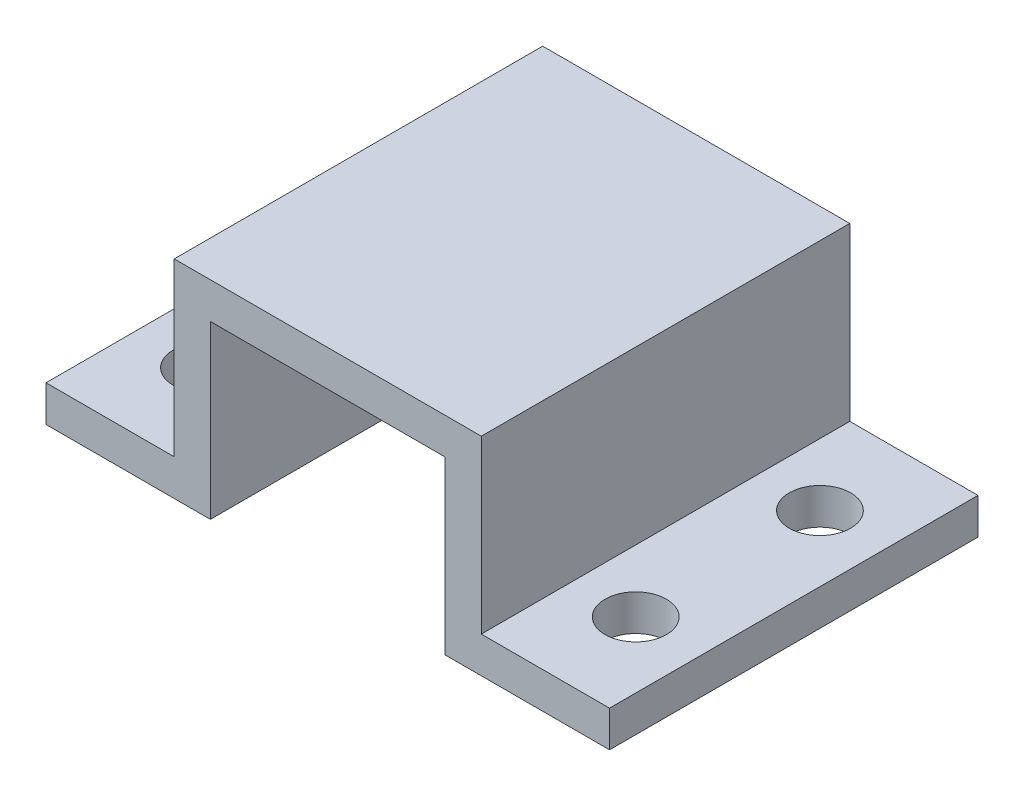
ISO-10303-21;
HEADER;
FILE_DESCRIPTION(('STEP AP214'),'2;1');
FILE_NAME('part.step','',(''),(''),'','','');
FILE_SCHEMA(('AUTOMOTIVE_DESIGN { 1 0 10303 214 1 1 1 1 }'));
ENDSEC;
DATA;
#1=APPLICATION_CONTEXT('core data for automotive mechanical design processes');
#2=APPLICATION_PROTOCOL_DEFINITION('international standard','automotive_design',2000,#1);
#3=PRODUCT_CONTEXT('',#1,'mechanical');
#4=PRODUCT('Part','Part','',(#3));
#5=PRODUCT_RELATED_PRODUCT_CATEGORY('part','',(#4));
#6=PRODUCT_DEFINITION_FORMATION('','',#4);
#7=PRODUCT_DEFINITION_CONTEXT('part definition',#1,'design');
#8=PRODUCT_DEFINITION('design','',#6,#7);
#9=PRODUCT_DEFINITION_SHAPE('','',#8);
#10=(LENGTH_UNIT() NAMED_UNIT(*) SI_UNIT(.MILLI.,.METRE.));
#11=(NAMED_UNIT(*) PLANE_ANGLE_UNIT() SI_UNIT($,.RADIAN.));
#12=(NAMED_UNIT(*) SI_UNIT($,.STERADIAN.) SOLID_ANGLE_UNIT());
#13=UNCERTAINTY_MEASURE_WITH_UNIT(LENGTH_MEASURE(1.E-05),#10,'distance_accuracy_value','');
#14=(GEOMETRIC_REPRESENTATION_CONTEXT(3) GLOBAL_UNCERTAINTY_ASSIGNED_CONTEXT((#13)) GLOBAL_UNIT_ASSIGNED_CONTEXT((#10,
#11,#12)) REPRESENTATION_CONTEXT('',''));
#15=CARTESIAN_POINT('',(0.,0.,0.));
#16=DIRECTION('',(0.,0.,1.));
#17=DIRECTION('',(1.,0.,0.));
#18=AXIS2_PLACEMENT_3D('',#15,#16,#17);
#19=CARTESIAN_POINT('',(0.,9.49,0.));
#20=DIRECTION('',(0.,1.,0.));
#21=DIRECTION('',(0.,0.,1.));
#22=AXIS2_PLACEMENT_3D('',#19,#20,#21);
#23=PLANE('',#22);
#24=DIRECTION('',(0.,0.,1.));
#25=VECTOR('',#24,1.);
#26=CARTESIAN_POINT('',(6.5,9.49,-10.2));
#27=LINE('',#26,#25);
#28=CARTESIAN_POINT('',(6.5,9.49,-10.2));
#29=VERTEX_POINT('',#28);
#30=CARTESIAN_POINT('',(6.5,9.49,10.2));
#31=VERTEX_POINT('',#30);
#32=EDGE_CURVE('E149',#29,#31,#27,.T.);
#33=ORIENTED_EDGE('',*,*,#32,.T.);
#34=DIRECTION('',(1.,0.,0.));
#35=VECTOR('',#34,1.);
#36=CARTESIAN_POINT('',(-8.49999999999999,9.49,10.2));
#37=LINE('',#36,#35);
#38=CARTESIAN_POINT('',(-6.5,9.49,10.2));
#39=VERTEX_POINT('',#38);
#40=EDGE_CURVE('E145',#39,#31,#37,.T.);
#41=ORIENTED_EDGE('',*,*,#40,.F.);
#42=DIRECTION('',(0.,0.,-1.));
#43=VECTOR('',#42,1.);
#44=CARTESIAN_POINT('',(-6.5,9.49,-10.2));
#45=LINE('',#44,#43);
#46=CARTESIAN_POINT('',(-6.5,9.49,-10.2));
#47=VERTEX_POINT('',#46);
#48=EDGE_CURVE('E160',#39,#47,#45,.T.);
#49=ORIENTED_EDGE('',*,*,#48,.T.);
#50=DIRECTION('',(-1.,0.,0.));
#51=VECTOR('',#50,1.);
#52=CARTESIAN_POINT('',(-8.49999999999999,9.49,-10.2));
#53=LINE('',#52,#51);
#54=EDGE_CURVE('E136',#29,#47,#53,.T.);
#55=ORIENTED_EDGE('',*,*,#54,.F.);
#56=EDGE_LOOP('',(#33,#41,#49,#55));
#57=FACE_BOUND('',#56,.T.);
#58=ADVANCED_FACE('F43',(#57),#23,.F.);
#59=CARTESIAN_POINT('',(0.,2.,0.));
#60=DIRECTION('',(0.,1.,0.));
#61=DIRECTION('',(0.,0.,1.));
#62=AXIS2_PLACEMENT_3D('',#59,#60,#61);
#63=PLANE('',#62);
#64=CARTESIAN_POINT('',(-11.95,2.,-5.1));
#65=DIRECTION('',(0.,1.,0.));
#66=DIRECTION('',(0.,0.,1.));
#67=AXIS2_PLACEMENT_3D('',#64,#65,#66);
#68=CIRCLE('',#67,1.7);
#69=CARTESIAN_POINT('',(-11.95,2.,-3.4));
#70=VERTEX_POINT('',#69);
#71=EDGE_CURVE('E203',#70,#70,#68,.T.);
#72=ORIENTED_EDGE('',*,*,#71,.F.);
#73=EDGE_LOOP('',(#72));
#74=FACE_BOUND('',#73,.T.);
#75=CARTESIAN_POINT('',(-11.95,2.,5.1));
#76=DIRECTION('',(0.,1.,0.));
#77=DIRECTION('',(0.,0.,1.));
#78=AXIS2_PLACEMENT_3D('',#75,#76,#77);
#79=CIRCLE('',#78,1.7);
#80=CARTESIAN_POINT('',(-11.95,2.,6.8));
#81=VERTEX_POINT('',#80);
#82=EDGE_CURVE('E207',#81,#81,#79,.F.);
#83=ORIENTED_EDGE('',*,*,#82,.T.);
#84=EDGE_LOOP('',(#83));
#85=FACE_BOUND('',#84,.T.);
#86=DIRECTION('',(1.,0.,0.));
#87=VECTOR('',#86,1.);
#88=CARTESIAN_POINT('',(0.,2.,10.2));
#89=LINE('',#88,#87);
#90=CARTESIAN_POINT('',(-15.6,2.,10.2));
#91=VERTEX_POINT('',#90);
#92=CARTESIAN_POINT('',(-8.49999999999999,2.,10.2));
#93=VERTEX_POINT('',#92);
#94=EDGE_CURVE('E59',#91,#93,#89,.T.);
#95=ORIENTED_EDGE('',*,*,#94,.T.);
#96=DIRECTION('',(0.,0.,-1.));
#97=VECTOR('',#96,1.);
#98=CARTESIAN_POINT('',(-8.49999999999999,2.,0.));
#99=LINE('',#98,#97);
#100=CARTESIAN_POINT('',(-8.49999999999999,2.,-10.2));
#101=VERTEX_POINT('',#100);
#102=EDGE_CURVE('E63',#93,#101,#99,.T.);
#103=ORIENTED_EDGE('',*,*,#102,.T.);
#104=DIRECTION('',(1.,0.,0.));
#105=VECTOR('',#104,1.);
#106=CARTESIAN_POINT('',(0.,2.,-10.2));
#107=LINE('',#106,#105);
#108=CARTESIAN_POINT('',(-15.6,2.,-10.2));
#109=VERTEX_POINT('',#108);
#110=EDGE_CURVE('E193',#109,#101,#107,.T.);
#111=ORIENTED_EDGE('',*,*,#110,.F.);
#112=DIRECTION('',(0.,0.,-1.));
#113=VECTOR('',#112,1.);
#114=CARTESIAN_POINT('',(-15.6,2.,0.));
#115=LINE('',#114,#113);
#116=EDGE_CURVE('E196',#91,#109,#115,.T.);
#117=ORIENTED_EDGE('',*,*,#116,.F.);
#118=EDGE_LOOP('',(#95,#103,#111,#117));
#119=FACE_BOUND('',#118,.T.);
#120=ADVANCED_FACE('F353',(#74,#85,#119),#63,.T.);
#121=CARTESIAN_POINT('',(-6.5,2.,0.));
#122=DIRECTION('',(1.,0.,0.));
#123=DIRECTION('',(0.,0.,-1.));
#124=AXIS2_PLACEMENT_3D('',#121,#122,#123);
#125=PLANE('',#124);
#126=DIRECTION('',(0.,0.,1.));
#127=VECTOR('',#126,1.);
#128=CARTESIAN_POINT('',(-6.5,0.,0.));
#129=LINE('',#128,#127);
#130=CARTESIAN_POINT('',(-6.5,0.,-10.2));
#131=VERTEX_POINT('',#130);
#132=CARTESIAN_POINT('',(-6.5,0.,10.2));
#133=VERTEX_POINT('',#132);
#134=EDGE_CURVE('E192',#131,#133,#129,.T.);
#135=ORIENTED_EDGE('',*,*,#134,.F.);
#136=DIRECTION('',(0.,-1.,0.));
#137=VECTOR('',#136,1.);
#138=CARTESIAN_POINT('',(-6.5,2.,-10.2));
#139=LINE('',#138,#137);
#140=EDGE_CURVE('E11',#47,#131,#139,.T.);
#141=ORIENTED_EDGE('',*,*,#140,.F.);
#142=ORIENTED_EDGE('',*,*,#48,.F.);
#143=DIRECTION('',(0.,-1.,0.));
#144=VECTOR('',#143,1.);
#145=CARTESIAN_POINT('',(-6.5,2.,10.2));
#146=LINE('',#145,#144);
#147=EDGE_CURVE('E211',#39,#133,#146,.T.);
#148=ORIENTED_EDGE('',*,*,#147,.T.);
#149=EDGE_LOOP('',(#135,#141,#142,#148));
#150=FACE_BOUND('',#149,.T.);
#151=ADVANCED_FACE('F45',(#150),#125,.T.);
#152=CARTESIAN_POINT('',(0.,2.,-10.2));
#153=DIRECTION('',(0.,0.,-1.));
#154=DIRECTION('',(-1.,0.,0.));
#155=AXIS2_PLACEMENT_3D('',#152,#153,#154);
#156=PLANE('',#155);
#157=ORIENTED_EDGE('',*,*,#140,.T.);
#158=DIRECTION('',(1.,0.,0.));
#159=VECTOR('',#158,1.);
#160=CARTESIAN_POINT('',(0.,0.,-10.2));
#161=LINE('',#160,#159);
#162=CARTESIAN_POINT('',(-15.6,0.,-10.2));
#163=VERTEX_POINT('',#162);
#164=EDGE_CURVE('E215',#163,#131,#161,.T.);
#165=ORIENTED_EDGE('',*,*,#164,.F.);
#166=DIRECTION('',(0.,-1.,0.));
#167=VECTOR('',#166,1.);
#168=CARTESIAN_POINT('',(-15.6,2.,-10.2));
#169=LINE('',#168,#167);
#170=EDGE_CURVE('E52',#109,#163,#169,.T.);
#171=ORIENTED_EDGE('',*,*,#170,.F.);
#172=ORIENTED_EDGE('',*,*,#110,.T.);
#173=DIRECTION('',(0.,-1.,0.));
#174=VECTOR('',#173,1.);
#175=CARTESIAN_POINT('',(-8.49999999999999,9.49,-10.2));
#176=LINE('',#175,#174);
#177=CARTESIAN_POINT('',(-8.49999999999999,11.49,-10.2));
#178=VERTEX_POINT('',#177);
#179=EDGE_CURVE('E187',#178,#101,#176,.T.);
#180=ORIENTED_EDGE('',*,*,#179,.F.);
#181=DIRECTION('',(-1.,0.,0.));
#182=VECTOR('',#181,1.);
#183=CARTESIAN_POINT('',(-8.49999999999999,11.49,-10.2));
#184=LINE('',#183,#182);
#185=CARTESIAN_POINT('',(8.49999999999999,11.49,-10.2));
#186=VERTEX_POINT('',#185);
#187=EDGE_CURVE('E178',#186,#178,#184,.T.);
#188=ORIENTED_EDGE('',*,*,#187,.F.);
#189=DIRECTION('',(0.,-1.,0.));
#190=VECTOR('',#189,1.);
#191=CARTESIAN_POINT('',(8.49999999999999,11.49,-10.2));
#192=LINE('',#191,#190);
#193=CARTESIAN_POINT('',(8.49999999999999,2.,-10.2));
#194=VERTEX_POINT('',#193);
#195=EDGE_CURVE('E174',#186,#194,#192,.T.);
#196=ORIENTED_EDGE('',*,*,#195,.T.);
#197=DIRECTION('',(-1.,0.,0.));
#198=VECTOR('',#197,1.);
#199=CARTESIAN_POINT('',(0.,2.,-10.2));
#200=LINE('',#199,#198);
#201=CARTESIAN_POINT('',(15.6,2.,-10.2));
#202=VERTEX_POINT('',#201);
#203=EDGE_CURVE('E277',#202,#194,#200,.T.);
#204=ORIENTED_EDGE('',*,*,#203,.F.);
#205=DIRECTION('',(0.,-1.,0.));
#206=VECTOR('',#205,1.);
#207=CARTESIAN_POINT('',(15.6,2.,-10.2));
#208=LINE('',#207,#206);
#209=CARTESIAN_POINT('',(15.6,0.,-10.2));
#210=VERTEX_POINT('',#209);
#211=EDGE_CURVE('E278',#202,#210,#208,.T.);
#212=ORIENTED_EDGE('',*,*,#211,.T.);
#213=DIRECTION('',(-1.,0.,0.));
#214=VECTOR('',#213,1.);
#215=CARTESIAN_POINT('',(0.,0.,-10.2));
#216=LINE('',#215,#214);
#217=CARTESIAN_POINT('',(6.50000000000001,0.,-10.2));
#218=VERTEX_POINT('',#217);
#219=EDGE_CURVE('E140',#210,#218,#216,.T.);
#220=ORIENTED_EDGE('',*,*,#219,.T.);
#221=DIRECTION('',(0.,-1.,0.));
#222=VECTOR('',#221,1.);
#223=CARTESIAN_POINT('',(6.50000000000001,2.,-10.2));
#224=LINE('',#223,#222);
#225=EDGE_CURVE('E132',#29,#218,#224,.T.);
#226=ORIENTED_EDGE('',*,*,#225,.F.);
#227=ORIENTED_EDGE('',*,*,#54,.T.);
#228=EDGE_LOOP('',(#157,#165,#171,#172,#180,#188,#196,#204,#212,#220,#226,#227));
#229=FACE_BOUND('',#228,.T.);
#230=ADVANCED_FACE('F134',(#229),#156,.T.);
#231=CARTESIAN_POINT('',(-15.6,2.,0.));
#232=DIRECTION('',(-1.,0.,0.));
#233=DIRECTION('',(0.,0.,1.));
#234=AXIS2_PLACEMENT_3D('',#231,#232,#233);
#235=PLANE('',#234);
#236=DIRECTION('',(0.,0.,-1.));
#237=VECTOR('',#236,1.);
#238=CARTESIAN_POINT('',(-15.6,0.,0.));
#239=LINE('',#238,#237);
#240=CARTESIAN_POINT('',(-15.6,0.,10.2));
#241=VERTEX_POINT('',#240);
#242=EDGE_CURVE('E218',#241,#163,#239,.T.);
#243=ORIENTED_EDGE('',*,*,#242,.F.);
#244=DIRECTION('',(0.,-1.,0.));
#245=VECTOR('',#244,1.);
#246=CARTESIAN_POINT('',(-15.6,2.,10.2));
#247=LINE('',#246,#245);
#248=EDGE_CURVE('E234',#91,#241,#247,.T.);
#249=ORIENTED_EDGE('',*,*,#248,.F.);
#250=ORIENTED_EDGE('',*,*,#116,.T.);
#251=ORIENTED_EDGE('',*,*,#170,.T.);
#252=EDGE_LOOP('',(#243,#249,#250,#251));
#253=FACE_BOUND('',#252,.T.);
#254=ADVANCED_FACE('F241',(#253),#235,.T.);
#255=CARTESIAN_POINT('',(-11.95,2.,-5.1));
#256=DIRECTION('',(0.,-1.,0.));
#257=DIRECTION('',(0.,0.,-1.));
#258=AXIS2_PLACEMENT_3D('',#255,#256,#257);
#259=CYLINDRICAL_SURFACE('',#258,1.7);
#260=ORIENTED_EDGE('',*,*,#71,.T.);
#261=EDGE_LOOP('',(#260));
#262=FACE_BOUND('',#261,.T.);
#263=CARTESIAN_POINT('',(-11.95,0.,-5.1));
#264=DIRECTION('',(0.,1.,0.));
#265=DIRECTION('',(0.,0.,1.));
#266=AXIS2_PLACEMENT_3D('',#263,#264,#265);
#267=CIRCLE('',#266,1.7);
#268=CARTESIAN_POINT('',(-11.95,0.,-3.4));
#269=VERTEX_POINT('',#268);
#270=EDGE_CURVE('E224',#269,#269,#267,.T.);
#271=ORIENTED_EDGE('',*,*,#270,.F.);
#272=EDGE_LOOP('',(#271));
#273=FACE_BOUND('',#272,.T.);
#274=ADVANCED_FACE('F372',(#262,#273),#259,.F.);
#275=CARTESIAN_POINT('',(0.,2.,10.2));
#276=DIRECTION('',(0.,0.,-1.));
#277=DIRECTION('',(-1.,0.,0.));
#278=AXIS2_PLACEMENT_3D('',#275,#276,#277);
#279=PLANE('',#278);
#280=ORIENTED_EDGE('',*,*,#147,.F.);
#281=ORIENTED_EDGE('',*,*,#40,.T.);
#282=DIRECTION('',(0.,-1.,0.));
#283=VECTOR('',#282,1.);
#284=CARTESIAN_POINT('',(6.50000000000001,2.,10.2));
#285=LINE('',#284,#283);
#286=CARTESIAN_POINT('',(6.50000000000001,0.,10.2));
#287=VERTEX_POINT('',#286);
#288=EDGE_CURVE('E146',#31,#287,#285,.T.);
#289=ORIENTED_EDGE('',*,*,#288,.T.);
#290=DIRECTION('',(-1.,0.,0.));
#291=VECTOR('',#290,1.);
#292=CARTESIAN_POINT('',(0.,0.,10.2));
#293=LINE('',#292,#291);
#294=CARTESIAN_POINT('',(15.6,0.,10.2));
#295=VERTEX_POINT('',#294);
#296=EDGE_CURVE('E251',#295,#287,#293,.T.);
#297=ORIENTED_EDGE('',*,*,#296,.F.);
#298=DIRECTION('',(0.,-1.,0.));
#299=VECTOR('',#298,1.);
#300=CARTESIAN_POINT('',(15.6,2.,10.2));
#301=LINE('',#300,#299);
#302=CARTESIAN_POINT('',(15.6,2.,10.2));
#303=VERTEX_POINT('',#302);
#304=EDGE_CURVE('E253',#303,#295,#301,.T.);
#305=ORIENTED_EDGE('',*,*,#304,.F.);
#306=DIRECTION('',(-1.,0.,0.));
#307=VECTOR('',#306,1.);
#308=CARTESIAN_POINT('',(0.,2.,10.2));
#309=LINE('',#308,#307);
#310=CARTESIAN_POINT('',(8.49999999999999,2.,10.2));
#311=VERTEX_POINT('',#310);
#312=EDGE_CURVE('E300',#303,#311,#309,.T.);
#313=ORIENTED_EDGE('',*,*,#312,.T.);
#314=DIRECTION('',(0.,-1.,0.));
#315=VECTOR('',#314,1.);
#316=CARTESIAN_POINT('',(8.49999999999999,11.49,10.2));
#317=LINE('',#316,#315);
#318=CARTESIAN_POINT('',(8.49999999999999,11.49,10.2));
#319=VERTEX_POINT('',#318);
#320=EDGE_CURVE('E177',#319,#311,#317,.T.);
#321=ORIENTED_EDGE('',*,*,#320,.F.);
#322=DIRECTION('',(1.,0.,0.));
#323=VECTOR('',#322,1.);
#324=CARTESIAN_POINT('',(-8.49999999999999,11.49,10.2));
#325=LINE('',#324,#323);
#326=CARTESIAN_POINT('',(-8.49999999999999,11.49,10.2));
#327=VERTEX_POINT('',#326);
#328=EDGE_CURVE('E168',#327,#319,#325,.T.);
#329=ORIENTED_EDGE('',*,*,#328,.F.);
#330=DIRECTION('',(0.,-1.,0.));
#331=VECTOR('',#330,1.);
#332=CARTESIAN_POINT('',(-8.49999999999999,9.49,10.2));
#333=LINE('',#332,#331);
#334=EDGE_CURVE('E183',#327,#93,#333,.T.);
#335=ORIENTED_EDGE('',*,*,#334,.T.);
#336=ORIENTED_EDGE('',*,*,#94,.F.);
#337=ORIENTED_EDGE('',*,*,#248,.T.);
#338=DIRECTION('',(1.,0.,0.));
#339=VECTOR('',#338,1.);
#340=CARTESIAN_POINT('',(0.,0.,10.2));
#341=LINE('',#340,#339);
#342=EDGE_CURVE('E221',#241,#133,#341,.T.);
#343=ORIENTED_EDGE('',*,*,#342,.T.);
#344=EDGE_LOOP('',(#280,#281,#289,#297,#305,#313,#321,#329,#335,#336,#337,#343));
#345=FACE_BOUND('',#344,.T.);
#346=ADVANCED_FACE('F248',(#345),#279,.F.);
#347=CARTESIAN_POINT('',(-11.95,2.,5.1));
#348=DIRECTION('',(0.,-1.,0.));
#349=DIRECTION('',(0.,0.,-1.));
#350=AXIS2_PLACEMENT_3D('',#347,#348,#349);
#351=CYLINDRICAL_SURFACE('',#350,1.7);
#352=ORIENTED_EDGE('',*,*,#82,.F.);
#353=EDGE_LOOP('',(#352));
#354=FACE_BOUND('',#353,.T.);
#355=CARTESIAN_POINT('',(-11.95,0.,5.1));
#356=DIRECTION('',(0.,1.,0.));
#357=DIRECTION('',(0.,0.,1.));
#358=AXIS2_PLACEMENT_3D('',#355,#356,#357);
#359=CIRCLE('',#358,1.7);
#360=CARTESIAN_POINT('',(-11.95,0.,6.8));
#361=VERTEX_POINT('',#360);
#362=EDGE_CURVE('E197',#361,#361,#359,.F.);
#363=ORIENTED_EDGE('',*,*,#362,.T.);
#364=EDGE_LOOP('',(#363));
#365=FACE_BOUND('',#364,.T.);
#366=ADVANCED_FACE('F368',(#354,#365),#351,.F.);
#367=CARTESIAN_POINT('',(0.,0.,0.));
#368=DIRECTION('',(0.,1.,0.));
#369=DIRECTION('',(0.,0.,1.));
#370=AXIS2_PLACEMENT_3D('',#367,#368,#369);
#371=PLANE('',#370);
#372=ORIENTED_EDGE('',*,*,#134,.T.);
#373=ORIENTED_EDGE('',*,*,#342,.F.);
#374=ORIENTED_EDGE('',*,*,#242,.T.);
#375=ORIENTED_EDGE('',*,*,#164,.T.);
#376=EDGE_LOOP('',(#372,#373,#374,#375));
#377=FACE_BOUND('',#376,.T.);
#378=ORIENTED_EDGE('',*,*,#362,.F.);
#379=EDGE_LOOP('',(#378));
#380=FACE_BOUND('',#379,.T.);
#381=ORIENTED_EDGE('',*,*,#270,.T.);
#382=EDGE_LOOP('',(#381));
#383=FACE_BOUND('',#382,.T.);
#384=ADVANCED_FACE('F245',(#377,#380,#383),#371,.F.);
#385=CARTESIAN_POINT('',(-8.49999999999999,9.49,-10.2));
#386=DIRECTION('',(1.,0.,0.));
#387=DIRECTION('',(0.,0.,-1.));
#388=AXIS2_PLACEMENT_3D('',#385,#386,#387);
#389=PLANE('',#388);
#390=ORIENTED_EDGE('',*,*,#102,.F.);
#391=ORIENTED_EDGE('',*,*,#334,.F.);
#392=DIRECTION('',(0.,0.,1.));
#393=VECTOR('',#392,1.);
#394=CARTESIAN_POINT('',(-8.49999999999999,11.49,-10.2));
#395=LINE('',#394,#393);
#396=EDGE_CURVE('E162',#178,#327,#395,.T.);
#397=ORIENTED_EDGE('',*,*,#396,.F.);
#398=ORIENTED_EDGE('',*,*,#179,.T.);
#399=EDGE_LOOP('',(#390,#391,#397,#398));
#400=FACE_BOUND('',#399,.T.);
#401=ADVANCED_FACE('F295',(#400),#389,.F.);
#402=CARTESIAN_POINT('',(8.49999999999999,11.49,-10.2));
#403=DIRECTION('',(-1.,0.,0.));
#404=DIRECTION('',(0.,0.,1.));
#405=AXIS2_PLACEMENT_3D('',#402,#403,#404);
#406=PLANE('',#405);
#407=ORIENTED_EDGE('',*,*,#320,.T.);
#408=DIRECTION('',(0.,0.,1.));
#409=VECTOR('',#408,1.);
#410=CARTESIAN_POINT('',(8.49999999999999,2.,0.));
#411=LINE('',#410,#409);
#412=EDGE_CURVE('E156',#194,#311,#411,.T.);
#413=ORIENTED_EDGE('',*,*,#412,.F.);
#414=ORIENTED_EDGE('',*,*,#195,.F.);
#415=DIRECTION('',(0.,0.,-1.));
#416=VECTOR('',#415,1.);
#417=CARTESIAN_POINT('',(8.49999999999999,11.49,-10.2));
#418=LINE('',#417,#416);
#419=EDGE_CURVE('E285',#319,#186,#418,.T.);
#420=ORIENTED_EDGE('',*,*,#419,.F.);
#421=EDGE_LOOP('',(#407,#413,#414,#420));
#422=FACE_BOUND('',#421,.T.);
#423=ADVANCED_FACE('F304',(#422),#406,.F.);
#424=CARTESIAN_POINT('',(0.,11.49,0.));
#425=DIRECTION('',(0.,1.,0.));
#426=DIRECTION('',(0.,0.,1.));
#427=AXIS2_PLACEMENT_3D('',#424,#425,#426);
#428=PLANE('',#427);
#429=ORIENTED_EDGE('',*,*,#396,.T.);
#430=ORIENTED_EDGE('',*,*,#328,.T.);
#431=ORIENTED_EDGE('',*,*,#419,.T.);
#432=ORIENTED_EDGE('',*,*,#187,.T.);
#433=EDGE_LOOP('',(#429,#430,#431,#432));
#434=FACE_BOUND('',#433,.T.);
#435=ADVANCED_FACE('F291',(#434),#428,.T.);
#436=CARTESIAN_POINT('',(0.,2.,0.));
#437=DIRECTION('',(0.,1.,0.));
#438=DIRECTION('',(0.,0.,1.));
#439=AXIS2_PLACEMENT_3D('',#436,#437,#438);
#440=PLANE('',#439);
#441=CARTESIAN_POINT('',(11.95,2.,5.1));
#442=DIRECTION('',(0.,1.,0.));
#443=DIRECTION('',(0.,0.,1.));
#444=AXIS2_PLACEMENT_3D('',#441,#442,#443);
#445=CIRCLE('',#444,1.7);
#446=CARTESIAN_POINT('',(11.95,2.,6.8));
#447=VERTEX_POINT('',#446);
#448=EDGE_CURVE('E320',#447,#447,#445,.T.);
#449=ORIENTED_EDGE('',*,*,#448,.F.);
#450=EDGE_LOOP('',(#449));
#451=FACE_BOUND('',#450,.T.);
#452=CARTESIAN_POINT('',(11.95,2.,-5.1));
#453=DIRECTION('',(0.,1.,0.));
#454=DIRECTION('',(0.,0.,1.));
#455=AXIS2_PLACEMENT_3D('',#452,#453,#454);
#456=CIRCLE('',#455,1.7);
#457=CARTESIAN_POINT('',(11.95,2.,-3.4));
#458=VERTEX_POINT('',#457);
#459=EDGE_CURVE('E280',#458,#458,#456,.F.);
#460=ORIENTED_EDGE('',*,*,#459,.T.);
#461=EDGE_LOOP('',(#460));
#462=FACE_BOUND('',#461,.T.);
#463=ORIENTED_EDGE('',*,*,#203,.T.);
#464=ORIENTED_EDGE('',*,*,#412,.T.);
#465=ORIENTED_EDGE('',*,*,#312,.F.);
#466=DIRECTION('',(0.,0.,-1.));
#467=VECTOR('',#466,1.);
#468=CARTESIAN_POINT('',(15.6,2.,0.));
#469=LINE('',#468,#467);
#470=EDGE_CURVE('E310',#303,#202,#469,.T.);
#471=ORIENTED_EDGE('',*,*,#470,.T.);
#472=EDGE_LOOP('',(#463,#464,#465,#471));
#473=FACE_BOUND('',#472,.T.);
#474=ADVANCED_FACE('F308',(#451,#462,#473),#440,.T.);
#475=CARTESIAN_POINT('',(6.50000000000001,2.,0.));
#476=DIRECTION('',(1.,0.,0.));
#477=DIRECTION('',(0.,0.,-1.));
#478=AXIS2_PLACEMENT_3D('',#475,#476,#477);
#479=PLANE('',#478);
#480=DIRECTION('',(0.,0.,1.));
#481=VECTOR('',#480,1.);
#482=CARTESIAN_POINT('',(6.50000000000001,0.,0.));
#483=LINE('',#482,#481);
#484=EDGE_CURVE('E255',#218,#287,#483,.T.);
#485=ORIENTED_EDGE('',*,*,#484,.T.);
#486=ORIENTED_EDGE('',*,*,#288,.F.);
#487=ORIENTED_EDGE('',*,*,#32,.F.);
#488=ORIENTED_EDGE('',*,*,#225,.T.);
#489=EDGE_LOOP('',(#485,#486,#487,#488));
#490=FACE_BOUND('',#489,.T.);
#491=ADVANCED_FACE('F150',(#490),#479,.F.);
#492=CARTESIAN_POINT('',(11.95,2.,5.1));
#493=DIRECTION('',(0.,-1.,0.));
#494=DIRECTION('',(0.,0.,-1.));
#495=AXIS2_PLACEMENT_3D('',#492,#493,#494);
#496=CYLINDRICAL_SURFACE('',#495,1.7);
#497=ORIENTED_EDGE('',*,*,#448,.T.);
#498=EDGE_LOOP('',(#497));
#499=FACE_BOUND('',#498,.T.);
#500=CARTESIAN_POINT('',(11.95,0.,5.1));
#501=DIRECTION('',(0.,1.,0.));
#502=DIRECTION('',(0.,0.,1.));
#503=AXIS2_PLACEMENT_3D('',#500,#501,#502);
#504=CIRCLE('',#503,1.7);
#505=CARTESIAN_POINT('',(11.95,0.,6.8));
#506=VERTEX_POINT('',#505);
#507=EDGE_CURVE('E269',#506,#506,#504,.T.);
#508=ORIENTED_EDGE('',*,*,#507,.F.);
#509=EDGE_LOOP('',(#508));
#510=FACE_BOUND('',#509,.T.);
#511=ADVANCED_FACE('F341',(#499,#510),#496,.F.);
#512=CARTESIAN_POINT('',(15.6,2.,0.));
#513=DIRECTION('',(-1.,0.,0.));
#514=DIRECTION('',(0.,0.,1.));
#515=AXIS2_PLACEMENT_3D('',#512,#513,#514);
#516=PLANE('',#515);
#517=DIRECTION('',(0.,0.,-1.));
#518=VECTOR('',#517,1.);
#519=CARTESIAN_POINT('',(15.6,0.,0.));
#520=LINE('',#519,#518);
#521=EDGE_CURVE('E261',#295,#210,#520,.T.);
#522=ORIENTED_EDGE('',*,*,#521,.T.);
#523=ORIENTED_EDGE('',*,*,#211,.F.);
#524=ORIENTED_EDGE('',*,*,#470,.F.);
#525=ORIENTED_EDGE('',*,*,#304,.T.);
#526=EDGE_LOOP('',(#522,#523,#524,#525));
#527=FACE_BOUND('',#526,.T.);
#528=ADVANCED_FACE('F332',(#527),#516,.F.);
#529=CARTESIAN_POINT('',(11.95,2.,-5.1));
#530=DIRECTION('',(0.,-1.,0.));
#531=DIRECTION('',(0.,0.,-1.));
#532=AXIS2_PLACEMENT_3D('',#529,#530,#531);
#533=CYLINDRICAL_SURFACE('',#532,1.7);
#534=ORIENTED_EDGE('',*,*,#459,.F.);
#535=EDGE_LOOP('',(#534));
#536=FACE_BOUND('',#535,.T.);
#537=CARTESIAN_POINT('',(11.95,0.,-5.1));
#538=DIRECTION('',(0.,1.,0.));
#539=DIRECTION('',(0.,0.,1.));
#540=AXIS2_PLACEMENT_3D('',#537,#538,#539);
#541=CIRCLE('',#540,1.7);
#542=CARTESIAN_POINT('',(11.95,0.,-3.4));
#543=VERTEX_POINT('',#542);
#544=EDGE_CURVE('E273',#543,#543,#541,.F.);
#545=ORIENTED_EDGE('',*,*,#544,.T.);
#546=EDGE_LOOP('',(#545));
#547=FACE_BOUND('',#546,.T.);
#548=ADVANCED_FACE('F328',(#536,#547),#533,.F.);
#549=CARTESIAN_POINT('',(0.,0.,0.));
#550=DIRECTION('',(0.,1.,0.));
#551=DIRECTION('',(0.,0.,1.));
#552=AXIS2_PLACEMENT_3D('',#549,#550,#551);
#553=PLANE('',#552);
#554=ORIENTED_EDGE('',*,*,#484,.F.);
#555=ORIENTED_EDGE('',*,*,#219,.F.);
#556=ORIENTED_EDGE('',*,*,#521,.F.);
#557=ORIENTED_EDGE('',*,*,#296,.T.);
#558=EDGE_LOOP('',(#554,#555,#556,#557));
#559=FACE_BOUND('',#558,.T.);
#560=ORIENTED_EDGE('',*,*,#544,.F.);
#561=EDGE_LOOP('',(#560));
#562=FACE_BOUND('',#561,.T.);
#563=ORIENTED_EDGE('',*,*,#507,.T.);
#564=EDGE_LOOP('',(#563));
#565=FACE_BOUND('',#564,.T.);
#566=ADVANCED_FACE('F331',(#559,#562,#565),#553,.F.);
#567=CLOSED_SHELL('',(#58,#120,#151,#230,#254,#274,#346,#366,#384,#401,#423,#435,#474,#491,#511,
#528,#548,#566));
#568=MANIFOLD_SOLID_BREP('B2',#567);
#569=ADVANCED_BREP_SHAPE_REPRESENTATION('',(#18,#568),#14);
#570=SHAPE_DEFINITION_REPRESENTATION(#9,#569);
ENDSEC;
END-ISO-10303-21;
